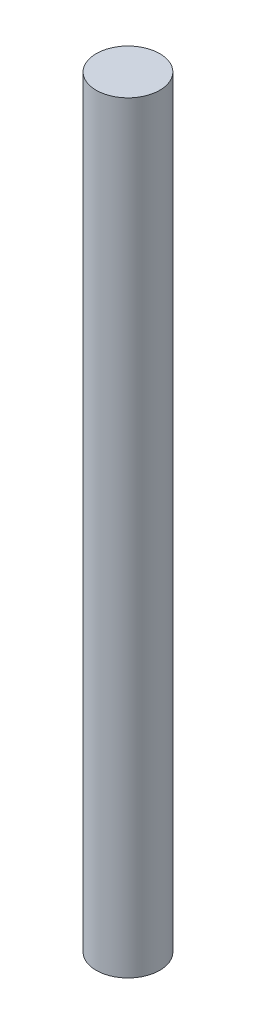
ISO-10303-21;
HEADER;
FILE_DESCRIPTION(('STEP AP214'),'2;1');
FILE_NAME('part.step','',(''),(''),'','','');
FILE_SCHEMA(('AUTOMOTIVE_DESIGN { 1 0 10303 214 1 1 1 1 }'));
ENDSEC;
DATA;
#1=APPLICATION_CONTEXT('core data for automotive mechanical design processes');
#2=APPLICATION_PROTOCOL_DEFINITION('international standard','automotive_design',2000,#1);
#3=PRODUCT_CONTEXT('',#1,'mechanical');
#4=PRODUCT('Part','Part','',(#3));
#5=PRODUCT_RELATED_PRODUCT_CATEGORY('part','',(#4));
#6=PRODUCT_DEFINITION_FORMATION('','',#4);
#7=PRODUCT_DEFINITION_CONTEXT('part definition',#1,'design');
#8=PRODUCT_DEFINITION('design','',#6,#7);
#9=PRODUCT_DEFINITION_SHAPE('','',#8);
#10=(LENGTH_UNIT() NAMED_UNIT(*) SI_UNIT(.MILLI.,.METRE.));
#11=(NAMED_UNIT(*) PLANE_ANGLE_UNIT() SI_UNIT($,.RADIAN.));
#12=(NAMED_UNIT(*) SI_UNIT($,.STERADIAN.) SOLID_ANGLE_UNIT());
#13=UNCERTAINTY_MEASURE_WITH_UNIT(LENGTH_MEASURE(1.E-05),#10,'distance_accuracy_value','');
#14=(GEOMETRIC_REPRESENTATION_CONTEXT(3) GLOBAL_UNCERTAINTY_ASSIGNED_CONTEXT((#13)) GLOBAL_UNIT_ASSIGNED_CONTEXT((#10,
#11,#12)) REPRESENTATION_CONTEXT('',''));
#15=CARTESIAN_POINT('',(0.,0.,0.));
#16=DIRECTION('',(0.,0.,1.));
#17=DIRECTION('',(1.,0.,0.));
#18=AXIS2_PLACEMENT_3D('',#15,#16,#17);
#19=CARTESIAN_POINT('',(0.,24.,0.));
#20=DIRECTION('',(0.,-1.,0.));
#21=DIRECTION('',(0.,0.,-1.));
#22=AXIS2_PLACEMENT_3D('',#19,#20,#21);
#23=CYLINDRICAL_SURFACE('',#22,1.);
#24=CARTESIAN_POINT('',(0.,24.,0.));
#25=DIRECTION('',(0.,1.,0.));
#26=DIRECTION('',(0.,0.,1.));
#27=AXIS2_PLACEMENT_3D('',#24,#25,#26);
#28=CIRCLE('',#27,1.);
#29=CARTESIAN_POINT('',(0.,24.,1.));
#30=VERTEX_POINT('',#29);
#31=EDGE_CURVE('E10',#30,#30,#28,.T.);
#32=ORIENTED_EDGE('',*,*,#31,.F.);
#33=EDGE_LOOP('',(#32));
#34=FACE_BOUND('',#33,.T.);
#35=CARTESIAN_POINT('',(0.,0.,0.));
#36=DIRECTION('',(0.,1.,0.));
#37=DIRECTION('',(0.,0.,1.));
#38=AXIS2_PLACEMENT_3D('',#35,#36,#37);
#39=CIRCLE('',#38,1.);
#40=CARTESIAN_POINT('',(0.,0.,1.));
#41=VERTEX_POINT('',#40);
#42=EDGE_CURVE('E39',#41,#41,#39,.T.);
#43=ORIENTED_EDGE('',*,*,#42,.T.);
#44=EDGE_LOOP('',(#43));
#45=FACE_BOUND('',#44,.T.);
#46=ADVANCED_FACE('F36',(#34,#45),#23,.T.);
#47=CARTESIAN_POINT('',(0.,24.,0.));
#48=DIRECTION('',(0.,1.,0.));
#49=DIRECTION('',(0.,0.,1.));
#50=AXIS2_PLACEMENT_3D('',#47,#48,#49);
#51=PLANE('',#50);
#52=ORIENTED_EDGE('',*,*,#31,.T.);
#53=EDGE_LOOP('',(#52));
#54=FACE_BOUND('',#53,.T.);
#55=ADVANCED_FACE('F51',(#54),#51,.T.);
#56=CARTESIAN_POINT('',(0.,0.,0.));
#57=DIRECTION('',(0.,1.,0.));
#58=DIRECTION('',(0.,0.,1.));
#59=AXIS2_PLACEMENT_3D('',#56,#57,#58);
#60=PLANE('',#59);
#61=ORIENTED_EDGE('',*,*,#42,.F.);
#62=EDGE_LOOP('',(#61));
#63=FACE_BOUND('',#62,.T.);
#64=ADVANCED_FACE('F49',(#63),#60,.F.);
#65=CLOSED_SHELL('',(#46,#55,#64));
#66=MANIFOLD_SOLID_BREP('B2',#65);
#67=ADVANCED_BREP_SHAPE_REPRESENTATION('',(#18,#66),#14);
#68=SHAPE_DEFINITION_REPRESENTATION(#9,#67);
ENDSEC;
END-ISO-10303-21;
